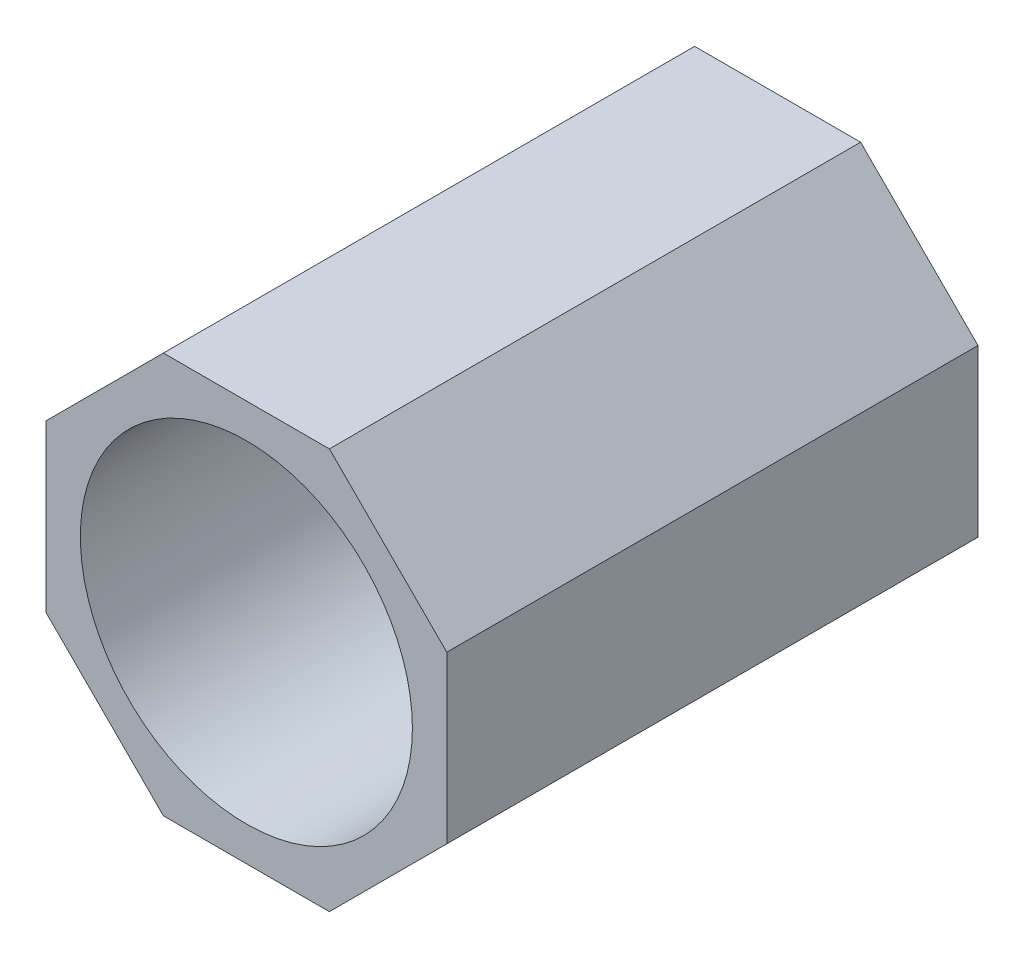
ISO-10303-21;
HEADER;
FILE_DESCRIPTION(('STEP AP214'),'2;1');
FILE_NAME('part.step','',(''),(''),'','','');
FILE_SCHEMA(('AUTOMOTIVE_DESIGN { 1 0 10303 214 1 1 1 1 }'));
ENDSEC;
DATA;
#1=APPLICATION_CONTEXT('core data for automotive mechanical design processes');
#2=APPLICATION_PROTOCOL_DEFINITION('international standard','automotive_design',2000,#1);
#3=PRODUCT_CONTEXT('',#1,'mechanical');
#4=PRODUCT('Part','Part','',(#3));
#5=PRODUCT_RELATED_PRODUCT_CATEGORY('part','',(#4));
#6=PRODUCT_DEFINITION_FORMATION('','',#4);
#7=PRODUCT_DEFINITION_CONTEXT('part definition',#1,'design');
#8=PRODUCT_DEFINITION('design','',#6,#7);
#9=PRODUCT_DEFINITION_SHAPE('','',#8);
#10=(LENGTH_UNIT() NAMED_UNIT(*) SI_UNIT(.MILLI.,.METRE.));
#11=(NAMED_UNIT(*) PLANE_ANGLE_UNIT() SI_UNIT($,.RADIAN.));
#12=(NAMED_UNIT(*) SI_UNIT($,.STERADIAN.) SOLID_ANGLE_UNIT());
#13=UNCERTAINTY_MEASURE_WITH_UNIT(LENGTH_MEASURE(1.E-05),#10,'distance_accuracy_value','');
#14=(GEOMETRIC_REPRESENTATION_CONTEXT(3) GLOBAL_UNCERTAINTY_ASSIGNED_CONTEXT((#13)) GLOBAL_UNIT_ASSIGNED_CONTEXT((#10,
#11,#12)) REPRESENTATION_CONTEXT('',''));
#15=CARTESIAN_POINT('',(0.,0.,0.));
#16=DIRECTION('',(0.,0.,1.));
#17=DIRECTION('',(1.,0.,0.));
#18=AXIS2_PLACEMENT_3D('',#15,#16,#17);
#19=CARTESIAN_POINT('',(0.,0.,8.));
#20=DIRECTION('',(0.,0.,-1.));
#21=DIRECTION('',(-1.,0.,0.));
#22=AXIS2_PLACEMENT_3D('',#19,#20,#21);
#23=PLANE('',#22);
#24=DIRECTION('',(-0.707106781186548,-0.707106781186547,0.));
#25=VECTOR('',#24,1.);
#26=CARTESIAN_POINT('',(-3.01776695296637,1.25,8.));
#27=LINE('',#26,#25);
#28=CARTESIAN_POINT('',(-1.25,3.01776695296637,8.));
#29=VERTEX_POINT('',#28);
#30=CARTESIAN_POINT('',(-3.01776695296637,1.25,8.));
#31=VERTEX_POINT('',#30);
#32=EDGE_CURVE('E149',#29,#31,#27,.T.);
#33=ORIENTED_EDGE('',*,*,#32,.T.);
#34=DIRECTION('',(0.,-1.,0.));
#35=VECTOR('',#34,1.);
#36=CARTESIAN_POINT('',(-3.01776695296637,-1.25,8.));
#37=LINE('',#36,#35);
#38=CARTESIAN_POINT('',(-3.01776695296637,-1.25,8.));
#39=VERTEX_POINT('',#38);
#40=EDGE_CURVE('E97',#31,#39,#37,.T.);
#41=ORIENTED_EDGE('',*,*,#40,.T.);
#42=DIRECTION('',(0.707106781186548,-0.707106781186547,0.));
#43=VECTOR('',#42,1.);
#44=CARTESIAN_POINT('',(-1.25,-3.01776695296637,8.));
#45=LINE('',#44,#43);
#46=CARTESIAN_POINT('',(-1.25,-3.01776695296637,8.));
#47=VERTEX_POINT('',#46);
#48=EDGE_CURVE('E164',#39,#47,#45,.T.);
#49=ORIENTED_EDGE('',*,*,#48,.T.);
#50=DIRECTION('',(1.,0.,0.));
#51=VECTOR('',#50,1.);
#52=CARTESIAN_POINT('',(1.25,-3.01776695296637,8.));
#53=LINE('',#52,#51);
#54=CARTESIAN_POINT('',(1.25,-3.01776695296637,8.));
#55=VERTEX_POINT('',#54);
#56=EDGE_CURVE('E177',#47,#55,#53,.T.);
#57=ORIENTED_EDGE('',*,*,#56,.T.);
#58=DIRECTION('',(0.707106781186548,0.707106781186547,0.));
#59=VECTOR('',#58,1.);
#60=CARTESIAN_POINT('',(3.01776695296637,-1.25,8.));
#61=LINE('',#60,#59);
#62=CARTESIAN_POINT('',(3.01776695296637,-1.25,8.));
#63=VERTEX_POINT('',#62);
#64=EDGE_CURVE('E116',#55,#63,#61,.T.);
#65=ORIENTED_EDGE('',*,*,#64,.T.);
#66=DIRECTION('',(0.,1.,0.));
#67=VECTOR('',#66,1.);
#68=CARTESIAN_POINT('',(3.01776695296637,1.25,8.));
#69=LINE('',#68,#67);
#70=CARTESIAN_POINT('',(3.01776695296637,1.25,8.));
#71=VERTEX_POINT('',#70);
#72=EDGE_CURVE('E110',#63,#71,#69,.T.);
#73=ORIENTED_EDGE('',*,*,#72,.T.);
#74=DIRECTION('',(-0.707106781186548,0.707106781186547,0.));
#75=VECTOR('',#74,1.);
#76=CARTESIAN_POINT('',(1.25,3.01776695296637,8.));
#77=LINE('',#76,#75);
#78=CARTESIAN_POINT('',(1.25,3.01776695296637,8.));
#79=VERTEX_POINT('',#78);
#80=EDGE_CURVE('E114',#71,#79,#77,.T.);
#81=ORIENTED_EDGE('',*,*,#80,.T.);
#82=DIRECTION('',(-1.,0.,0.));
#83=VECTOR('',#82,1.);
#84=CARTESIAN_POINT('',(-1.25,3.01776695296637,8.));
#85=LINE('',#84,#83);
#86=EDGE_CURVE('E54',#79,#29,#85,.T.);
#87=ORIENTED_EDGE('',*,*,#86,.T.);
#88=EDGE_LOOP('',(#33,#41,#49,#57,#65,#73,#81,#87));
#89=FACE_BOUND('',#88,.T.);
#90=CARTESIAN_POINT('',(0.,0.,8.));
#91=DIRECTION('',(0.,0.,1.));
#92=DIRECTION('',(1.,0.,0.));
#93=AXIS2_PLACEMENT_3D('',#90,#91,#92);
#94=CIRCLE('',#93,2.5);
#95=CARTESIAN_POINT('',(2.5,0.,8.));
#96=VERTEX_POINT('',#95);
#97=EDGE_CURVE('E138',#96,#96,#94,.T.);
#98=ORIENTED_EDGE('',*,*,#97,.F.);
#99=EDGE_LOOP('',(#98));
#100=FACE_BOUND('',#99,.T.);
#101=ADVANCED_FACE('F37',(#89,#100),#23,.F.);
#102=CARTESIAN_POINT('',(0.,0.,0.));
#103=DIRECTION('',(0.,0.,-1.));
#104=DIRECTION('',(-1.,0.,0.));
#105=AXIS2_PLACEMENT_3D('',#102,#103,#104);
#106=PLANE('',#105);
#107=DIRECTION('',(-0.707106781186548,-0.707106781186547,0.));
#108=VECTOR('',#107,1.);
#109=CARTESIAN_POINT('',(-3.01776695296637,1.25,0.));
#110=LINE('',#109,#108);
#111=CARTESIAN_POINT('',(-1.25,3.01776695296637,0.));
#112=VERTEX_POINT('',#111);
#113=CARTESIAN_POINT('',(-3.01776695296637,1.25,0.));
#114=VERTEX_POINT('',#113);
#115=EDGE_CURVE('E134',#112,#114,#110,.T.);
#116=ORIENTED_EDGE('',*,*,#115,.F.);
#117=DIRECTION('',(-1.,0.,0.));
#118=VECTOR('',#117,1.);
#119=CARTESIAN_POINT('',(-1.25,3.01776695296637,0.));
#120=LINE('',#119,#118);
#121=CARTESIAN_POINT('',(1.25,3.01776695296637,0.));
#122=VERTEX_POINT('',#121);
#123=EDGE_CURVE('E89',#122,#112,#120,.T.);
#124=ORIENTED_EDGE('',*,*,#123,.F.);
#125=DIRECTION('',(-0.707106781186548,0.707106781186547,0.));
#126=VECTOR('',#125,1.);
#127=CARTESIAN_POINT('',(1.25,3.01776695296637,0.));
#128=LINE('',#127,#126);
#129=CARTESIAN_POINT('',(3.01776695296637,1.25,0.));
#130=VERTEX_POINT('',#129);
#131=EDGE_CURVE('E83',#130,#122,#128,.T.);
#132=ORIENTED_EDGE('',*,*,#131,.F.);
#133=DIRECTION('',(0.,1.,0.));
#134=VECTOR('',#133,1.);
#135=CARTESIAN_POINT('',(3.01776695296637,1.25,0.));
#136=LINE('',#135,#134);
#137=CARTESIAN_POINT('',(3.01776695296637,-1.25,0.));
#138=VERTEX_POINT('',#137);
#139=EDGE_CURVE('E124',#138,#130,#136,.T.);
#140=ORIENTED_EDGE('',*,*,#139,.F.);
#141=DIRECTION('',(0.707106781186548,0.707106781186547,0.));
#142=VECTOR('',#141,1.);
#143=CARTESIAN_POINT('',(3.01776695296637,-1.25,0.));
#144=LINE('',#143,#142);
#145=CARTESIAN_POINT('',(1.25,-3.01776695296637,0.));
#146=VERTEX_POINT('',#145);
#147=EDGE_CURVE('E144',#146,#138,#144,.T.);
#148=ORIENTED_EDGE('',*,*,#147,.F.);
#149=DIRECTION('',(1.,0.,0.));
#150=VECTOR('',#149,1.);
#151=CARTESIAN_POINT('',(1.25,-3.01776695296637,0.));
#152=LINE('',#151,#150);
#153=CARTESIAN_POINT('',(-1.25,-3.01776695296637,0.));
#154=VERTEX_POINT('',#153);
#155=EDGE_CURVE('E142',#154,#146,#152,.T.);
#156=ORIENTED_EDGE('',*,*,#155,.F.);
#157=DIRECTION('',(0.707106781186548,-0.707106781186547,0.));
#158=VECTOR('',#157,1.);
#159=CARTESIAN_POINT('',(-1.25,-3.01776695296637,0.));
#160=LINE('',#159,#158);
#161=CARTESIAN_POINT('',(-3.01776695296637,-1.25,0.));
#162=VERTEX_POINT('',#161);
#163=EDGE_CURVE('E140',#162,#154,#160,.T.);
#164=ORIENTED_EDGE('',*,*,#163,.F.);
#165=DIRECTION('',(0.,-1.,0.));
#166=VECTOR('',#165,1.);
#167=CARTESIAN_POINT('',(-3.01776695296637,-1.25,0.));
#168=LINE('',#167,#166);
#169=EDGE_CURVE('E137',#114,#162,#168,.T.);
#170=ORIENTED_EDGE('',*,*,#169,.F.);
#171=EDGE_LOOP('',(#116,#124,#132,#140,#148,#156,#164,#170));
#172=FACE_BOUND('',#171,.T.);
#173=CARTESIAN_POINT('',(0.,0.,0.));
#174=DIRECTION('',(0.,0.,1.));
#175=DIRECTION('',(1.,0.,0.));
#176=AXIS2_PLACEMENT_3D('',#173,#174,#175);
#177=CIRCLE('',#176,2.5);
#178=CARTESIAN_POINT('',(2.5,0.,0.));
#179=VERTEX_POINT('',#178);
#180=EDGE_CURVE('E183',#179,#179,#177,.T.);
#181=ORIENTED_EDGE('',*,*,#180,.T.);
#182=EDGE_LOOP('',(#181));
#183=FACE_BOUND('',#182,.T.);
#184=ADVANCED_FACE('F168',(#172,#183),#106,.T.);
#185=CARTESIAN_POINT('',(-3.01776695296637,1.25,8.));
#186=DIRECTION('',(0.707106781186547,-0.707106781186548,0.));
#187=DIRECTION('',(0.707106781186548,0.707106781186547,0.));
#188=AXIS2_PLACEMENT_3D('',#185,#186,#187);
#189=PLANE('',#188);
#190=ORIENTED_EDGE('',*,*,#115,.T.);
#191=DIRECTION('',(0.,0.,-1.));
#192=VECTOR('',#191,1.);
#193=CARTESIAN_POINT('',(-3.01776695296637,1.25,8.));
#194=LINE('',#193,#192);
#195=EDGE_CURVE('E11',#31,#114,#194,.T.);
#196=ORIENTED_EDGE('',*,*,#195,.F.);
#197=ORIENTED_EDGE('',*,*,#32,.F.);
#198=DIRECTION('',(0.,0.,-1.));
#199=VECTOR('',#198,1.);
#200=CARTESIAN_POINT('',(-1.25,3.01776695296637,8.));
#201=LINE('',#200,#199);
#202=EDGE_CURVE('E130',#29,#112,#201,.T.);
#203=ORIENTED_EDGE('',*,*,#202,.T.);
#204=EDGE_LOOP('',(#190,#196,#197,#203));
#205=FACE_BOUND('',#204,.T.);
#206=ADVANCED_FACE('F39',(#205),#189,.F.);
#207=CARTESIAN_POINT('',(-3.01776695296637,-1.25,8.));
#208=DIRECTION('',(1.,0.,0.));
#209=DIRECTION('',(0.,0.,-1.));
#210=AXIS2_PLACEMENT_3D('',#207,#208,#209);
#211=PLANE('',#210);
#212=ORIENTED_EDGE('',*,*,#169,.T.);
#213=DIRECTION('',(0.,0.,-1.));
#214=VECTOR('',#213,1.);
#215=CARTESIAN_POINT('',(-3.01776695296637,-1.25,8.));
#216=LINE('',#215,#214);
#217=EDGE_CURVE('E46',#39,#162,#216,.T.);
#218=ORIENTED_EDGE('',*,*,#217,.F.);
#219=ORIENTED_EDGE('',*,*,#40,.F.);
#220=ORIENTED_EDGE('',*,*,#195,.T.);
#221=EDGE_LOOP('',(#212,#218,#219,#220));
#222=FACE_BOUND('',#221,.T.);
#223=ADVANCED_FACE('F211',(#222),#211,.F.);
#224=CARTESIAN_POINT('',(-1.25,-3.01776695296637,8.));
#225=DIRECTION('',(0.707106781186547,0.707106781186548,0.));
#226=DIRECTION('',(-0.707106781186548,0.707106781186547,0.));
#227=AXIS2_PLACEMENT_3D('',#224,#225,#226);
#228=PLANE('',#227);
#229=ORIENTED_EDGE('',*,*,#163,.T.);
#230=DIRECTION('',(0.,0.,-1.));
#231=VECTOR('',#230,1.);
#232=CARTESIAN_POINT('',(-1.25,-3.01776695296637,8.));
#233=LINE('',#232,#231);
#234=EDGE_CURVE('E156',#47,#154,#233,.T.);
#235=ORIENTED_EDGE('',*,*,#234,.F.);
#236=ORIENTED_EDGE('',*,*,#48,.F.);
#237=ORIENTED_EDGE('',*,*,#217,.T.);
#238=EDGE_LOOP('',(#229,#235,#236,#237));
#239=FACE_BOUND('',#238,.T.);
#240=ADVANCED_FACE('F162',(#239),#228,.F.);
#241=CARTESIAN_POINT('',(1.25,-3.01776695296637,8.));
#242=DIRECTION('',(0.,1.,0.));
#243=DIRECTION('',(0.,0.,1.));
#244=AXIS2_PLACEMENT_3D('',#241,#242,#243);
#245=PLANE('',#244);
#246=ORIENTED_EDGE('',*,*,#155,.T.);
#247=DIRECTION('',(0.,0.,-1.));
#248=VECTOR('',#247,1.);
#249=CARTESIAN_POINT('',(1.25,-3.01776695296637,8.));
#250=LINE('',#249,#248);
#251=EDGE_CURVE('E153',#55,#146,#250,.T.);
#252=ORIENTED_EDGE('',*,*,#251,.F.);
#253=ORIENTED_EDGE('',*,*,#56,.F.);
#254=ORIENTED_EDGE('',*,*,#234,.T.);
#255=EDGE_LOOP('',(#246,#252,#253,#254));
#256=FACE_BOUND('',#255,.T.);
#257=ADVANCED_FACE('F173',(#256),#245,.F.);
#258=CARTESIAN_POINT('',(3.01776695296637,-1.25,8.));
#259=DIRECTION('',(-0.707106781186547,0.707106781186548,0.));
#260=DIRECTION('',(-0.707106781186548,-0.707106781186547,0.));
#261=AXIS2_PLACEMENT_3D('',#258,#259,#260);
#262=PLANE('',#261);
#263=ORIENTED_EDGE('',*,*,#147,.T.);
#264=DIRECTION('',(0.,0.,-1.));
#265=VECTOR('',#264,1.);
#266=CARTESIAN_POINT('',(3.01776695296637,-1.25,8.));
#267=LINE('',#266,#265);
#268=EDGE_CURVE('E125',#63,#138,#267,.T.);
#269=ORIENTED_EDGE('',*,*,#268,.F.);
#270=ORIENTED_EDGE('',*,*,#64,.F.);
#271=ORIENTED_EDGE('',*,*,#251,.T.);
#272=EDGE_LOOP('',(#263,#269,#270,#271));
#273=FACE_BOUND('',#272,.T.);
#274=ADVANCED_FACE('F176',(#273),#262,.F.);
#275=CARTESIAN_POINT('',(3.01776695296637,1.25,8.));
#276=DIRECTION('',(-1.,0.,0.));
#277=DIRECTION('',(0.,0.,1.));
#278=AXIS2_PLACEMENT_3D('',#275,#276,#277);
#279=PLANE('',#278);
#280=ORIENTED_EDGE('',*,*,#139,.T.);
#281=DIRECTION('',(0.,0.,-1.));
#282=VECTOR('',#281,1.);
#283=CARTESIAN_POINT('',(3.01776695296637,1.25,8.));
#284=LINE('',#283,#282);
#285=EDGE_CURVE('E121',#71,#130,#284,.T.);
#286=ORIENTED_EDGE('',*,*,#285,.F.);
#287=ORIENTED_EDGE('',*,*,#72,.F.);
#288=ORIENTED_EDGE('',*,*,#268,.T.);
#289=EDGE_LOOP('',(#280,#286,#287,#288));
#290=FACE_BOUND('',#289,.T.);
#291=ADVANCED_FACE('F122',(#290),#279,.F.);
#292=CARTESIAN_POINT('',(1.25,3.01776695296637,8.));
#293=DIRECTION('',(-0.707106781186547,-0.707106781186548,0.));
#294=DIRECTION('',(0.707106781186548,-0.707106781186547,0.));
#295=AXIS2_PLACEMENT_3D('',#292,#293,#294);
#296=PLANE('',#295);
#297=ORIENTED_EDGE('',*,*,#131,.T.);
#298=DIRECTION('',(0.,0.,-1.));
#299=VECTOR('',#298,1.);
#300=CARTESIAN_POINT('',(1.25,3.01776695296637,8.));
#301=LINE('',#300,#299);
#302=EDGE_CURVE('E126',#79,#122,#301,.T.);
#303=ORIENTED_EDGE('',*,*,#302,.F.);
#304=ORIENTED_EDGE('',*,*,#80,.F.);
#305=ORIENTED_EDGE('',*,*,#285,.T.);
#306=EDGE_LOOP('',(#297,#303,#304,#305));
#307=FACE_BOUND('',#306,.T.);
#308=ADVANCED_FACE('F128',(#307),#296,.F.);
#309=CARTESIAN_POINT('',(-1.25,3.01776695296637,8.));
#310=DIRECTION('',(0.,-1.,0.));
#311=DIRECTION('',(0.,0.,-1.));
#312=AXIS2_PLACEMENT_3D('',#309,#310,#311);
#313=PLANE('',#312);
#314=ORIENTED_EDGE('',*,*,#123,.T.);
#315=ORIENTED_EDGE('',*,*,#202,.F.);
#316=ORIENTED_EDGE('',*,*,#86,.F.);
#317=ORIENTED_EDGE('',*,*,#302,.T.);
#318=EDGE_LOOP('',(#314,#315,#316,#317));
#319=FACE_BOUND('',#318,.T.);
#320=ADVANCED_FACE('F199',(#319),#313,.F.);
#321=CARTESIAN_POINT('',(0.,0.,8.));
#322=DIRECTION('',(0.,0.,-1.));
#323=DIRECTION('',(-1.,0.,0.));
#324=AXIS2_PLACEMENT_3D('',#321,#322,#323);
#325=CYLINDRICAL_SURFACE('',#324,2.5);
#326=ORIENTED_EDGE('',*,*,#97,.T.);
#327=EDGE_LOOP('',(#326));
#328=FACE_BOUND('',#327,.T.);
#329=ORIENTED_EDGE('',*,*,#180,.F.);
#330=EDGE_LOOP('',(#329));
#331=FACE_BOUND('',#330,.T.);
#332=ADVANCED_FACE('F189',(#328,#331),#325,.F.);
#333=CLOSED_SHELL('',(#101,#184,#206,#223,#240,#257,#274,#291,#308,#320,#332));
#334=MANIFOLD_SOLID_BREP('B2',#333);
#335=ADVANCED_BREP_SHAPE_REPRESENTATION('',(#18,#334),#14);
#336=SHAPE_DEFINITION_REPRESENTATION(#9,#335);
ENDSEC;
END-ISO-10303-21;
